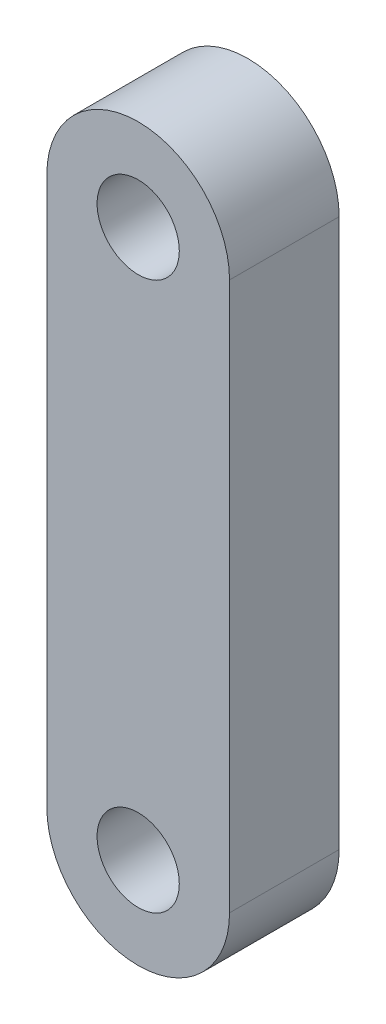
ISO-10303-21;
HEADER;
FILE_DESCRIPTION(('STEP AP214'),'2;1');
FILE_NAME('part.step','',(''),(''),'','','');
FILE_SCHEMA(('AUTOMOTIVE_DESIGN { 1 0 10303 214 1 1 1 1 }'));
ENDSEC;
DATA;
#1=APPLICATION_CONTEXT('core data for automotive mechanical design processes');
#2=APPLICATION_PROTOCOL_DEFINITION('international standard','automotive_design',2000,#1);
#3=PRODUCT_CONTEXT('',#1,'mechanical');
#4=PRODUCT('Part','Part','',(#3));
#5=PRODUCT_RELATED_PRODUCT_CATEGORY('part','',(#4));
#6=PRODUCT_DEFINITION_FORMATION('','',#4);
#7=PRODUCT_DEFINITION_CONTEXT('part definition',#1,'design');
#8=PRODUCT_DEFINITION('design','',#6,#7);
#9=PRODUCT_DEFINITION_SHAPE('','',#8);
#10=(LENGTH_UNIT() NAMED_UNIT(*) SI_UNIT(.MILLI.,.METRE.));
#11=(NAMED_UNIT(*) PLANE_ANGLE_UNIT() SI_UNIT($,.RADIAN.));
#12=(NAMED_UNIT(*) SI_UNIT($,.STERADIAN.) SOLID_ANGLE_UNIT());
#13=UNCERTAINTY_MEASURE_WITH_UNIT(LENGTH_MEASURE(1.E-05),#10,'distance_accuracy_value','');
#14=(GEOMETRIC_REPRESENTATION_CONTEXT(3) GLOBAL_UNCERTAINTY_ASSIGNED_CONTEXT((#13)) GLOBAL_UNIT_ASSIGNED_CONTEXT((#10,
#11,#12)) REPRESENTATION_CONTEXT('',''));
#15=CARTESIAN_POINT('',(0.,0.,0.));
#16=DIRECTION('',(0.,0.,1.));
#17=DIRECTION('',(1.,0.,0.));
#18=AXIS2_PLACEMENT_3D('',#15,#16,#17);
#19=CARTESIAN_POINT('',(0.,-15.,3.));
#20=DIRECTION('',(0.,0.,-1.));
#21=DIRECTION('',(-1.,0.,0.));
#22=AXIS2_PLACEMENT_3D('',#19,#20,#21);
#23=CYLINDRICAL_SURFACE('',#22,5.);
#24=CARTESIAN_POINT('',(0.,-15.,-3.));
#25=DIRECTION('',(0.,0.,1.));
#26=DIRECTION('',(1.,0.,0.));
#27=AXIS2_PLACEMENT_3D('',#24,#25,#26);
#28=CIRCLE('',#27,5.);
#29=CARTESIAN_POINT('',(-5.,-15.,-3.));
#30=VERTEX_POINT('',#29);
#31=CARTESIAN_POINT('',(5.,-15.,-3.));
#32=VERTEX_POINT('',#31);
#33=EDGE_CURVE('E96',#30,#32,#28,.T.);
#34=ORIENTED_EDGE('',*,*,#33,.T.);
#35=DIRECTION('',(0.,0.,-1.));
#36=VECTOR('',#35,1.);
#37=CARTESIAN_POINT('',(5.,-15.,3.));
#38=LINE('',#37,#36);
#39=CARTESIAN_POINT('',(5.,-15.,3.));
#40=VERTEX_POINT('',#39);
#41=EDGE_CURVE('E11',#40,#32,#38,.T.);
#42=ORIENTED_EDGE('',*,*,#41,.F.);
#43=CARTESIAN_POINT('',(0.,-15.,3.));
#44=DIRECTION('',(0.,0.,1.));
#45=DIRECTION('',(1.,0.,0.));
#46=AXIS2_PLACEMENT_3D('',#43,#44,#45);
#47=CIRCLE('',#46,5.);
#48=CARTESIAN_POINT('',(-5.,-15.,3.));
#49=VERTEX_POINT('',#48);
#50=EDGE_CURVE('E84',#49,#40,#47,.T.);
#51=ORIENTED_EDGE('',*,*,#50,.F.);
#52=DIRECTION('',(0.,0.,-1.));
#53=VECTOR('',#52,1.);
#54=CARTESIAN_POINT('',(-5.,-15.,3.));
#55=LINE('',#54,#53);
#56=EDGE_CURVE('E92',#49,#30,#55,.T.);
#57=ORIENTED_EDGE('',*,*,#56,.T.);
#58=EDGE_LOOP('',(#34,#42,#51,#57));
#59=FACE_BOUND('',#58,.T.);
#60=ADVANCED_FACE('F33',(#59),#23,.T.);
#61=CARTESIAN_POINT('',(5.,-15.,3.));
#62=DIRECTION('',(-1.,0.,0.));
#63=DIRECTION('',(0.,-1.,0.));
#64=AXIS2_PLACEMENT_3D('',#61,#62,#63);
#65=PLANE('',#64);
#66=DIRECTION('',(0.,1.,0.));
#67=VECTOR('',#66,1.);
#68=CARTESIAN_POINT('',(5.,-15.,-3.));
#69=LINE('',#68,#67);
#70=CARTESIAN_POINT('',(4.99999999999999,15.,-3.));
#71=VERTEX_POINT('',#70);
#72=EDGE_CURVE('E88',#32,#71,#69,.T.);
#73=ORIENTED_EDGE('',*,*,#72,.T.);
#74=DIRECTION('',(0.,0.,-1.));
#75=VECTOR('',#74,1.);
#76=CARTESIAN_POINT('',(4.99999999999999,15.,3.));
#77=LINE('',#76,#75);
#78=CARTESIAN_POINT('',(4.99999999999999,15.,3.));
#79=VERTEX_POINT('',#78);
#80=EDGE_CURVE('E41',#79,#71,#77,.T.);
#81=ORIENTED_EDGE('',*,*,#80,.F.);
#82=DIRECTION('',(0.,1.,0.));
#83=VECTOR('',#82,1.);
#84=CARTESIAN_POINT('',(5.,-15.,3.));
#85=LINE('',#84,#83);
#86=EDGE_CURVE('E79',#40,#79,#85,.T.);
#87=ORIENTED_EDGE('',*,*,#86,.F.);
#88=ORIENTED_EDGE('',*,*,#41,.T.);
#89=EDGE_LOOP('',(#73,#81,#87,#88));
#90=FACE_BOUND('',#89,.T.);
#91=ADVANCED_FACE('F87',(#90),#65,.F.);
#92=CARTESIAN_POINT('',(0.,15.,3.));
#93=DIRECTION('',(0.,0.,-1.));
#94=DIRECTION('',(-1.,0.,0.));
#95=AXIS2_PLACEMENT_3D('',#92,#93,#94);
#96=CYLINDRICAL_SURFACE('',#95,5.);
#97=CARTESIAN_POINT('',(0.,15.,-3.));
#98=DIRECTION('',(0.,0.,1.));
#99=DIRECTION('',(1.,0.,0.));
#100=AXIS2_PLACEMENT_3D('',#97,#98,#99);
#101=CIRCLE('',#100,5.);
#102=CARTESIAN_POINT('',(-5.00000000000001,15.,-3.));
#103=VERTEX_POINT('',#102);
#104=EDGE_CURVE('E66',#71,#103,#101,.T.);
#105=ORIENTED_EDGE('',*,*,#104,.T.);
#106=DIRECTION('',(0.,0.,-1.));
#107=VECTOR('',#106,1.);
#108=CARTESIAN_POINT('',(-5.00000000000001,15.,3.));
#109=LINE('',#108,#107);
#110=CARTESIAN_POINT('',(-5.00000000000001,15.,3.));
#111=VERTEX_POINT('',#110);
#112=EDGE_CURVE('E89',#111,#103,#109,.T.);
#113=ORIENTED_EDGE('',*,*,#112,.F.);
#114=CARTESIAN_POINT('',(0.,15.,3.));
#115=DIRECTION('',(0.,0.,1.));
#116=DIRECTION('',(1.,0.,0.));
#117=AXIS2_PLACEMENT_3D('',#114,#115,#116);
#118=CIRCLE('',#117,5.);
#119=EDGE_CURVE('E82',#79,#111,#118,.T.);
#120=ORIENTED_EDGE('',*,*,#119,.F.);
#121=ORIENTED_EDGE('',*,*,#80,.T.);
#122=EDGE_LOOP('',(#105,#113,#120,#121));
#123=FACE_BOUND('',#122,.T.);
#124=ADVANCED_FACE('F90',(#123),#96,.T.);
#125=CARTESIAN_POINT('',(-5.,-15.,3.));
#126=DIRECTION('',(1.,0.,0.));
#127=DIRECTION('',(0.,1.,0.));
#128=AXIS2_PLACEMENT_3D('',#125,#126,#127);
#129=PLANE('',#128);
#130=DIRECTION('',(0.,-1.,0.));
#131=VECTOR('',#130,1.);
#132=CARTESIAN_POINT('',(-5.,-15.,-3.));
#133=LINE('',#132,#131);
#134=EDGE_CURVE('E72',#103,#30,#133,.T.);
#135=ORIENTED_EDGE('',*,*,#134,.T.);
#136=ORIENTED_EDGE('',*,*,#56,.F.);
#137=DIRECTION('',(0.,-1.,0.));
#138=VECTOR('',#137,1.);
#139=CARTESIAN_POINT('',(-5.,-15.,3.));
#140=LINE('',#139,#138);
#141=EDGE_CURVE('E49',#111,#49,#140,.T.);
#142=ORIENTED_EDGE('',*,*,#141,.F.);
#143=ORIENTED_EDGE('',*,*,#112,.T.);
#144=EDGE_LOOP('',(#135,#136,#142,#143));
#145=FACE_BOUND('',#144,.T.);
#146=ADVANCED_FACE('F104',(#145),#129,.F.);
#147=CARTESIAN_POINT('',(0.,-15.,3.));
#148=DIRECTION('',(0.,0.,1.));
#149=DIRECTION('',(1.,0.,0.));
#150=AXIS2_PLACEMENT_3D('',#147,#148,#149);
#151=PLANE('',#150);
#152=CARTESIAN_POINT('',(0.,15.,3.));
#153=DIRECTION('',(0.,0.,1.));
#154=DIRECTION('',(1.,0.,0.));
#155=AXIS2_PLACEMENT_3D('',#152,#153,#154);
#156=CIRCLE('',#155,2.24999999999999);
#157=CARTESIAN_POINT('',(2.24999999999998,15.,3.));
#158=VERTEX_POINT('',#157);
#159=EDGE_CURVE('E118',#158,#158,#156,.T.);
#160=ORIENTED_EDGE('',*,*,#159,.F.);
#161=EDGE_LOOP('',(#160));
#162=FACE_BOUND('',#161,.T.);
#163=CARTESIAN_POINT('',(0.,-15.,3.));
#164=DIRECTION('',(0.,0.,1.));
#165=DIRECTION('',(1.,0.,0.));
#166=AXIS2_PLACEMENT_3D('',#163,#164,#165);
#167=CIRCLE('',#166,2.24999999999999);
#168=CARTESIAN_POINT('',(2.24999999999999,-15.,3.));
#169=VERTEX_POINT('',#168);
#170=EDGE_CURVE('E112',#169,#169,#167,.T.);
#171=ORIENTED_EDGE('',*,*,#170,.F.);
#172=EDGE_LOOP('',(#171));
#173=FACE_BOUND('',#172,.T.);
#174=ORIENTED_EDGE('',*,*,#50,.T.);
#175=ORIENTED_EDGE('',*,*,#86,.T.);
#176=ORIENTED_EDGE('',*,*,#119,.T.);
#177=ORIENTED_EDGE('',*,*,#141,.T.);
#178=EDGE_LOOP('',(#174,#175,#176,#177));
#179=FACE_BOUND('',#178,.T.);
#180=ADVANCED_FACE('F80',(#162,#173,#179),#151,.T.);
#181=CARTESIAN_POINT('',(0.,-15.,-3.));
#182=DIRECTION('',(0.,0.,1.));
#183=DIRECTION('',(1.,0.,0.));
#184=AXIS2_PLACEMENT_3D('',#181,#182,#183);
#185=PLANE('',#184);
#186=CARTESIAN_POINT('',(0.,15.,-3.));
#187=DIRECTION('',(0.,0.,1.));
#188=DIRECTION('',(1.,0.,0.));
#189=AXIS2_PLACEMENT_3D('',#186,#187,#188);
#190=CIRCLE('',#189,2.24999999999999);
#191=CARTESIAN_POINT('',(2.24999999999999,15.,-3.));
#192=VERTEX_POINT('',#191);
#193=EDGE_CURVE('E115',#192,#192,#190,.T.);
#194=ORIENTED_EDGE('',*,*,#193,.T.);
#195=EDGE_LOOP('',(#194));
#196=FACE_BOUND('',#195,.T.);
#197=CARTESIAN_POINT('',(0.,-15.,-3.));
#198=DIRECTION('',(0.,0.,1.));
#199=DIRECTION('',(1.,0.,0.));
#200=AXIS2_PLACEMENT_3D('',#197,#198,#199);
#201=CIRCLE('',#200,2.24999999999999);
#202=CARTESIAN_POINT('',(2.24999999999999,-15.,-3.));
#203=VERTEX_POINT('',#202);
#204=EDGE_CURVE('E99',#203,#203,#201,.T.);
#205=ORIENTED_EDGE('',*,*,#204,.T.);
#206=EDGE_LOOP('',(#205));
#207=FACE_BOUND('',#206,.T.);
#208=ORIENTED_EDGE('',*,*,#33,.F.);
#209=ORIENTED_EDGE('',*,*,#134,.F.);
#210=ORIENTED_EDGE('',*,*,#104,.F.);
#211=ORIENTED_EDGE('',*,*,#72,.F.);
#212=EDGE_LOOP('',(#208,#209,#210,#211));
#213=FACE_BOUND('',#212,.T.);
#214=ADVANCED_FACE('F107',(#196,#207,#213),#185,.F.);
#215=CARTESIAN_POINT('',(0.,-15.,3.));
#216=DIRECTION('',(0.,0.,1.));
#217=DIRECTION('',(1.,0.,0.));
#218=AXIS2_PLACEMENT_3D('',#215,#216,#217);
#219=CYLINDRICAL_SURFACE('',#218,2.24999999999999);
#220=ORIENTED_EDGE('',*,*,#204,.F.);
#221=EDGE_LOOP('',(#220));
#222=FACE_BOUND('',#221,.T.);
#223=ORIENTED_EDGE('',*,*,#170,.T.);
#224=EDGE_LOOP('',(#223));
#225=FACE_BOUND('',#224,.T.);
#226=ADVANCED_FACE('F129',(#222,#225),#219,.F.);
#227=CARTESIAN_POINT('',(0.,15.,3.));
#228=DIRECTION('',(0.,0.,1.));
#229=DIRECTION('',(1.,0.,0.));
#230=AXIS2_PLACEMENT_3D('',#227,#228,#229);
#231=CYLINDRICAL_SURFACE('',#230,2.24999999999999);
#232=ORIENTED_EDGE('',*,*,#193,.F.);
#233=EDGE_LOOP('',(#232));
#234=FACE_BOUND('',#233,.T.);
#235=ORIENTED_EDGE('',*,*,#159,.T.);
#236=EDGE_LOOP('',(#235));
#237=FACE_BOUND('',#236,.T.);
#238=ADVANCED_FACE('F122',(#234,#237),#231,.F.);
#239=CLOSED_SHELL('',(#60,#91,#124,#146,#180,#214,#226,#238));
#240=MANIFOLD_SOLID_BREP('B2',#239);
#241=ADVANCED_BREP_SHAPE_REPRESENTATION('',(#18,#240),#14);
#242=SHAPE_DEFINITION_REPRESENTATION(#9,#241);
ENDSEC;
END-ISO-10303-21;
